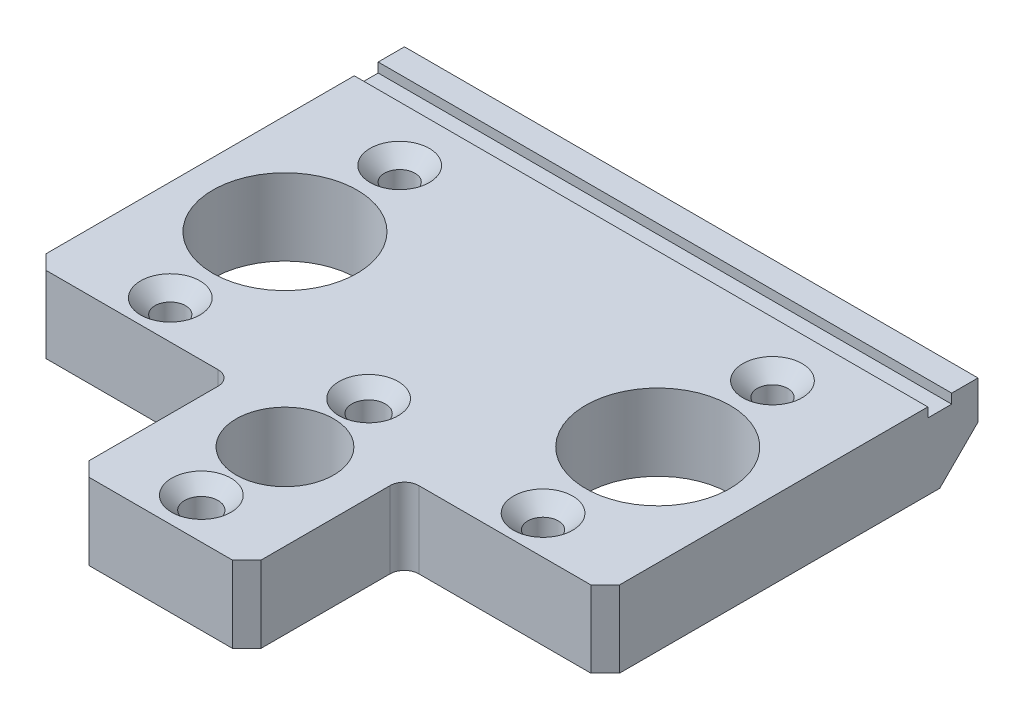
ISO-10303-21;
HEADER;
FILE_DESCRIPTION(('STEP AP214'),'2;1');
FILE_NAME('part.step','',(''),(''),'','','');
FILE_SCHEMA(('AUTOMOTIVE_DESIGN { 1 0 10303 214 1 1 1 1 }'));
ENDSEC;
DATA;
#1=APPLICATION_CONTEXT('core data for automotive mechanical design processes');
#2=APPLICATION_PROTOCOL_DEFINITION('international standard','automotive_design',2000,#1);
#3=PRODUCT_CONTEXT('',#1,'mechanical');
#4=PRODUCT('Part','Part','',(#3));
#5=PRODUCT_RELATED_PRODUCT_CATEGORY('part','',(#4));
#6=PRODUCT_DEFINITION_FORMATION('','',#4);
#7=PRODUCT_DEFINITION_CONTEXT('part definition',#1,'design');
#8=PRODUCT_DEFINITION('design','',#6,#7);
#9=PRODUCT_DEFINITION_SHAPE('','',#8);
#10=(LENGTH_UNIT() NAMED_UNIT(*) SI_UNIT(.MILLI.,.METRE.));
#11=(NAMED_UNIT(*) PLANE_ANGLE_UNIT() SI_UNIT($,.RADIAN.));
#12=(NAMED_UNIT(*) SI_UNIT($,.STERADIAN.) SOLID_ANGLE_UNIT());
#13=UNCERTAINTY_MEASURE_WITH_UNIT(LENGTH_MEASURE(1.E-05),#10,'distance_accuracy_value','');
#14=(GEOMETRIC_REPRESENTATION_CONTEXT(3) GLOBAL_UNCERTAINTY_ASSIGNED_CONTEXT((#13)) GLOBAL_UNIT_ASSIGNED_CONTEXT((#10,
#11,#12)) REPRESENTATION_CONTEXT('',''));
#15=CARTESIAN_POINT('',(0.,0.,0.));
#16=DIRECTION('',(0.,0.,1.));
#17=DIRECTION('',(1.,0.,0.));
#18=AXIS2_PLACEMENT_3D('',#15,#16,#17);
#19=CARTESIAN_POINT('',(0.,8.,0.));
#20=DIRECTION('',(0.,1.,0.));
#21=DIRECTION('',(0.,0.,1.));
#22=AXIS2_PLACEMENT_3D('',#19,#20,#21);
#23=PLANE('',#22);
#24=DIRECTION('',(1.,0.,0.));
#25=VECTOR('',#24,1.);
#26=CARTESIAN_POINT('',(-30.,8.,-17.25));
#27=LINE('',#26,#25);
#28=CARTESIAN_POINT('',(-30.,8.,-17.25));
#29=VERTEX_POINT('',#28);
#30=CARTESIAN_POINT('',(30.,8.,-17.25));
#31=VERTEX_POINT('',#30);
#32=EDGE_CURVE('E533',#29,#31,#27,.T.);
#33=ORIENTED_EDGE('',*,*,#32,.T.);
#34=DIRECTION('',(0.,0.,-1.));
#35=VECTOR('',#34,1.);
#36=CARTESIAN_POINT('',(30.,8.,-20.));
#37=LINE('',#36,#35);
#38=CARTESIAN_POINT('',(30.,8.,-20.));
#39=VERTEX_POINT('',#38);
#40=EDGE_CURVE('E199',#31,#39,#37,.T.);
#41=ORIENTED_EDGE('',*,*,#40,.T.);
#42=DIRECTION('',(-1.,0.,0.));
#43=VECTOR('',#42,1.);
#44=CARTESIAN_POINT('',(-30.,8.,-20.));
#45=LINE('',#44,#43);
#46=CARTESIAN_POINT('',(-30.,8.,-20.));
#47=VERTEX_POINT('',#46);
#48=EDGE_CURVE('E207',#39,#47,#45,.T.);
#49=ORIENTED_EDGE('',*,*,#48,.T.);
#50=DIRECTION('',(0.,0.,1.));
#51=VECTOR('',#50,1.);
#52=CARTESIAN_POINT('',(-30.,8.,-20.));
#53=LINE('',#52,#51);
#54=EDGE_CURVE('E195',#47,#29,#53,.T.);
#55=ORIENTED_EDGE('',*,*,#54,.T.);
#56=EDGE_LOOP('',(#33,#41,#49,#55));
#57=FACE_BOUND('',#56,.T.);
#58=ADVANCED_FACE('F37',(#57),#23,.T.);
#59=DIRECTION('',(1.,0.,0.));
#60=VECTOR('',#59,1.);
#61=CARTESIAN_POINT('',(-30.,8.,-14.75));
#62=LINE('',#61,#60);
#63=CARTESIAN_POINT('',(-30.,8.,-14.75));
#64=VERTEX_POINT('',#63);
#65=CARTESIAN_POINT('',(30.,8.,-14.75));
#66=VERTEX_POINT('',#65);
#67=EDGE_CURVE('E170',#64,#66,#62,.T.);
#68=ORIENTED_EDGE('',*,*,#67,.F.);
#69=CARTESIAN_POINT('',(-30.,8.,17.5));
#70=VERTEX_POINT('',#69);
#71=EDGE_CURVE('E184',#64,#70,#53,.T.);
#72=ORIENTED_EDGE('',*,*,#71,.T.);
#73=DIRECTION('',(0.707106781186548,0.,0.707106781186547));
#74=VECTOR('',#73,1.);
#75=CARTESIAN_POINT('',(-23.75,8.,23.75));
#76=LINE('',#75,#74);
#77=CARTESIAN_POINT('',(-28.5,8.,19.));
#78=VERTEX_POINT('',#77);
#79=EDGE_CURVE('E234',#70,#78,#76,.T.);
#80=ORIENTED_EDGE('',*,*,#79,.T.);
#81=DIRECTION('',(-1.,0.,0.));
#82=VECTOR('',#81,1.);
#83=CARTESIAN_POINT('',(-8.99999999999999,8.,19.));
#84=LINE('',#83,#82);
#85=CARTESIAN_POINT('',(-10.5,8.,19.));
#86=VERTEX_POINT('',#85);
#87=EDGE_CURVE('E303',#86,#78,#84,.T.);
#88=ORIENTED_EDGE('',*,*,#87,.F.);
#89=CARTESIAN_POINT('',(-10.5,8.,20.5));
#90=DIRECTION('',(0.,1.,0.));
#91=DIRECTION('',(0.,0.,1.));
#92=AXIS2_PLACEMENT_3D('',#89,#90,#91);
#93=CIRCLE('',#92,1.5);
#94=CARTESIAN_POINT('',(-8.99999999999999,7.99999999999999,20.5));
#95=VERTEX_POINT('',#94);
#96=EDGE_CURVE('E45',#86,#95,#93,.F.);
#97=ORIENTED_EDGE('',*,*,#96,.T.);
#98=DIRECTION('',(0.,0.,-1.));
#99=VECTOR('',#98,1.);
#100=CARTESIAN_POINT('',(-8.99999999999999,7.99999999999999,40.));
#101=LINE('',#100,#99);
#102=CARTESIAN_POINT('',(-8.99999999999999,7.99999999999999,34.));
#103=VERTEX_POINT('',#102);
#104=EDGE_CURVE('E318',#103,#95,#101,.T.);
#105=ORIENTED_EDGE('',*,*,#104,.F.);
#106=DIRECTION('',(0.707106781186546,0.,0.707106781186549));
#107=VECTOR('',#106,1.);
#108=CARTESIAN_POINT('',(-21.5,8.,21.4999999999999));
#109=LINE('',#108,#107);
#110=CARTESIAN_POINT('',(-7.5,7.99999999999999,35.5));
#111=VERTEX_POINT('',#110);
#112=EDGE_CURVE('E232',#103,#111,#109,.T.);
#113=ORIENTED_EDGE('',*,*,#112,.T.);
#114=DIRECTION('',(-1.,0.,0.));
#115=VECTOR('',#114,1.);
#116=CARTESIAN_POINT('',(8.99999999999999,7.99999999999999,35.5));
#117=LINE('',#116,#115);
#118=CARTESIAN_POINT('',(7.5,7.99999999999999,35.5));
#119=VERTEX_POINT('',#118);
#120=EDGE_CURVE('E498',#119,#111,#117,.T.);
#121=ORIENTED_EDGE('',*,*,#120,.F.);
#122=DIRECTION('',(0.707106781186546,0.,-0.707106781186549));
#123=VECTOR('',#122,1.);
#124=CARTESIAN_POINT('',(21.5,8.,21.4999999999999));
#125=LINE('',#124,#123);
#126=CARTESIAN_POINT('',(8.99999999999999,7.99999999999999,34.));
#127=VERTEX_POINT('',#126);
#128=EDGE_CURVE('E230',#119,#127,#125,.T.);
#129=ORIENTED_EDGE('',*,*,#128,.T.);
#130=DIRECTION('',(0.,0.,-1.));
#131=VECTOR('',#130,1.);
#132=CARTESIAN_POINT('',(8.99999999999999,7.99999999999999,40.));
#133=LINE('',#132,#131);
#134=CARTESIAN_POINT('',(8.99999999999999,7.99999999999999,20.5));
#135=VERTEX_POINT('',#134);
#136=EDGE_CURVE('E294',#127,#135,#133,.T.);
#137=ORIENTED_EDGE('',*,*,#136,.T.);
#138=CARTESIAN_POINT('',(10.5,8.,20.5));
#139=DIRECTION('',(0.,1.,0.));
#140=DIRECTION('',(0.,0.,1.));
#141=AXIS2_PLACEMENT_3D('',#138,#139,#140);
#142=CIRCLE('',#141,1.5);
#143=CARTESIAN_POINT('',(10.5,8.,19.));
#144=VERTEX_POINT('',#143);
#145=EDGE_CURVE('E287',#135,#144,#142,.F.);
#146=ORIENTED_EDGE('',*,*,#145,.T.);
#147=DIRECTION('',(-1.,0.,0.));
#148=VECTOR('',#147,1.);
#149=CARTESIAN_POINT('',(30.,8.,19.));
#150=LINE('',#149,#148);
#151=CARTESIAN_POINT('',(28.5,8.,19.));
#152=VERTEX_POINT('',#151);
#153=EDGE_CURVE('E292',#152,#144,#150,.T.);
#154=ORIENTED_EDGE('',*,*,#153,.F.);
#155=DIRECTION('',(0.707106781186545,0.,-0.70710678118655));
#156=VECTOR('',#155,1.);
#157=CARTESIAN_POINT('',(23.7500000000001,8.,23.7499999999999));
#158=LINE('',#157,#156);
#159=CARTESIAN_POINT('',(30.,8.,17.5));
#160=VERTEX_POINT('',#159);
#161=EDGE_CURVE('E236',#152,#160,#158,.T.);
#162=ORIENTED_EDGE('',*,*,#161,.T.);
#163=EDGE_CURVE('E187',#160,#66,#37,.T.);
#164=ORIENTED_EDGE('',*,*,#163,.T.);
#165=EDGE_LOOP('',(#68,#72,#80,#88,#97,#105,#113,#121,#129,#137,#146,#154,#162,#164));
#166=FACE_BOUND('',#165,.T.);
#167=CARTESIAN_POINT('',(0.,8.,31.25));
#168=DIRECTION('',(0.,1.,0.));
#169=DIRECTION('',(0.,0.,1.));
#170=AXIS2_PLACEMENT_3D('',#167,#168,#169);
#171=CIRCLE('',#170,3.1);
#172=CARTESIAN_POINT('',(0.,8.,34.35));
#173=VERTEX_POINT('',#172);
#174=EDGE_CURVE('E268',#173,#173,#171,.T.);
#175=ORIENTED_EDGE('',*,*,#174,.F.);
#176=EDGE_LOOP('',(#175));
#177=FACE_BOUND('',#176,.T.);
#178=CARTESIAN_POINT('',(0.,8.,13.75));
#179=DIRECTION('',(0.,1.,0.));
#180=DIRECTION('',(0.,0.,1.));
#181=AXIS2_PLACEMENT_3D('',#178,#179,#180);
#182=CIRCLE('',#181,3.1);
#183=CARTESIAN_POINT('',(0.,8.,16.85));
#184=VERTEX_POINT('',#183);
#185=EDGE_CURVE('E267',#184,#184,#182,.T.);
#186=ORIENTED_EDGE('',*,*,#185,.F.);
#187=EDGE_LOOP('',(#186));
#188=FACE_BOUND('',#187,.T.);
#189=CARTESIAN_POINT('',(19.5,8.,-9.));
#190=DIRECTION('',(0.,1.,0.));
#191=DIRECTION('',(0.,0.,1.));
#192=AXIS2_PLACEMENT_3D('',#189,#190,#191);
#193=CIRCLE('',#192,3.1);
#194=CARTESIAN_POINT('',(19.5,8.,-5.9));
#195=VERTEX_POINT('',#194);
#196=EDGE_CURVE('E544',#195,#195,#193,.T.);
#197=ORIENTED_EDGE('',*,*,#196,.F.);
#198=EDGE_LOOP('',(#197));
#199=FACE_BOUND('',#198,.T.);
#200=CARTESIAN_POINT('',(19.5,8.,15.));
#201=DIRECTION('',(0.,1.,0.));
#202=DIRECTION('',(0.,0.,1.));
#203=AXIS2_PLACEMENT_3D('',#200,#201,#202);
#204=CIRCLE('',#203,3.1);
#205=CARTESIAN_POINT('',(19.5,8.,18.1));
#206=VERTEX_POINT('',#205);
#207=EDGE_CURVE('E553',#206,#206,#204,.T.);
#208=ORIENTED_EDGE('',*,*,#207,.F.);
#209=EDGE_LOOP('',(#208));
#210=FACE_BOUND('',#209,.T.);
#211=CARTESIAN_POINT('',(-19.5,8.,15.));
#212=DIRECTION('',(0.,1.,0.));
#213=DIRECTION('',(0.,0.,1.));
#214=AXIS2_PLACEMENT_3D('',#211,#212,#213);
#215=CIRCLE('',#214,3.1);
#216=CARTESIAN_POINT('',(-19.5,8.,18.1));
#217=VERTEX_POINT('',#216);
#218=EDGE_CURVE('E562',#217,#217,#215,.T.);
#219=ORIENTED_EDGE('',*,*,#218,.F.);
#220=EDGE_LOOP('',(#219));
#221=FACE_BOUND('',#220,.T.);
#222=CARTESIAN_POINT('',(-19.5,8.,-9.));
#223=DIRECTION('',(0.,1.,0.));
#224=DIRECTION('',(0.,0.,1.));
#225=AXIS2_PLACEMENT_3D('',#222,#223,#224);
#226=CIRCLE('',#225,3.1);
#227=CARTESIAN_POINT('',(-19.5,8.,-5.9));
#228=VERTEX_POINT('',#227);
#229=EDGE_CURVE('E571',#228,#228,#226,.T.);
#230=ORIENTED_EDGE('',*,*,#229,.F.);
#231=EDGE_LOOP('',(#230));
#232=FACE_BOUND('',#231,.T.);
#233=CARTESIAN_POINT('',(0.,8.,22.5));
#234=DIRECTION('',(0.,1.,0.));
#235=DIRECTION('',(0.,0.,1.));
#236=AXIS2_PLACEMENT_3D('',#233,#234,#235);
#237=CIRCLE('',#236,5.1);
#238=CARTESIAN_POINT('',(0.,8.,27.6));
#239=VERTEX_POINT('',#238);
#240=EDGE_CURVE('E505',#239,#239,#237,.T.);
#241=ORIENTED_EDGE('',*,*,#240,.F.);
#242=EDGE_LOOP('',(#241));
#243=FACE_BOUND('',#242,.T.);
#244=CARTESIAN_POINT('',(-19.5,8.,3.));
#245=DIRECTION('',(0.,1.,0.));
#246=DIRECTION('',(0.,0.,1.));
#247=AXIS2_PLACEMENT_3D('',#244,#245,#246);
#248=CIRCLE('',#247,7.55);
#249=CARTESIAN_POINT('',(-19.5,8.,10.55));
#250=VERTEX_POINT('',#249);
#251=EDGE_CURVE('E210',#250,#250,#248,.T.);
#252=ORIENTED_EDGE('',*,*,#251,.F.);
#253=EDGE_LOOP('',(#252));
#254=FACE_BOUND('',#253,.T.);
#255=CARTESIAN_POINT('',(19.5,8.,3.));
#256=DIRECTION('',(0.,1.,0.));
#257=DIRECTION('',(0.,0.,-1.));
#258=AXIS2_PLACEMENT_3D('',#255,#256,#257);
#259=CIRCLE('',#258,7.55);
#260=CARTESIAN_POINT('',(19.5,8.,-4.55));
#261=VERTEX_POINT('',#260);
#262=EDGE_CURVE('E326',#261,#261,#259,.T.);
#263=ORIENTED_EDGE('',*,*,#262,.F.);
#264=EDGE_LOOP('',(#263));
#265=FACE_BOUND('',#264,.T.);
#266=ADVANCED_FACE('F181',(#166,#177,#188,#199,#210,#221,#232,#243,#254,#265),#23,.T.);
#267=CARTESIAN_POINT('',(0.,0.,0.));
#268=DIRECTION('',(0.,1.,0.));
#269=DIRECTION('',(0.,0.,1.));
#270=AXIS2_PLACEMENT_3D('',#267,#268,#269);
#271=PLANE('',#270);
#272=CARTESIAN_POINT('',(19.5,0.,-9.));
#273=DIRECTION('',(0.,1.,0.));
#274=DIRECTION('',(0.,0.,1.));
#275=AXIS2_PLACEMENT_3D('',#272,#273,#274);
#276=CIRCLE('',#275,1.6);
#277=CARTESIAN_POINT('',(19.5,0.,-7.4));
#278=VERTEX_POINT('',#277);
#279=EDGE_CURVE('E550',#278,#278,#276,.T.);
#280=ORIENTED_EDGE('',*,*,#279,.T.);
#281=EDGE_LOOP('',(#280));
#282=FACE_BOUND('',#281,.T.);
#283=CARTESIAN_POINT('',(19.5,0.,15.));
#284=DIRECTION('',(0.,1.,0.));
#285=DIRECTION('',(0.,0.,1.));
#286=AXIS2_PLACEMENT_3D('',#283,#284,#285);
#287=CIRCLE('',#286,1.6);
#288=CARTESIAN_POINT('',(19.5,0.,16.6));
#289=VERTEX_POINT('',#288);
#290=EDGE_CURVE('E559',#289,#289,#287,.T.);
#291=ORIENTED_EDGE('',*,*,#290,.T.);
#292=EDGE_LOOP('',(#291));
#293=FACE_BOUND('',#292,.T.);
#294=CARTESIAN_POINT('',(-19.5,0.,15.));
#295=DIRECTION('',(0.,1.,0.));
#296=DIRECTION('',(0.,0.,1.));
#297=AXIS2_PLACEMENT_3D('',#294,#295,#296);
#298=CIRCLE('',#297,1.6);
#299=CARTESIAN_POINT('',(-19.5,0.,16.6));
#300=VERTEX_POINT('',#299);
#301=EDGE_CURVE('E568',#300,#300,#298,.T.);
#302=ORIENTED_EDGE('',*,*,#301,.T.);
#303=EDGE_LOOP('',(#302));
#304=FACE_BOUND('',#303,.T.);
#305=CARTESIAN_POINT('',(-19.5,0.,-9.));
#306=DIRECTION('',(0.,1.,0.));
#307=DIRECTION('',(0.,0.,1.));
#308=AXIS2_PLACEMENT_3D('',#305,#306,#307);
#309=CIRCLE('',#308,1.6);
#310=CARTESIAN_POINT('',(-19.5,0.,-7.4));
#311=VERTEX_POINT('',#310);
#312=EDGE_CURVE('E577',#311,#311,#309,.T.);
#313=ORIENTED_EDGE('',*,*,#312,.T.);
#314=EDGE_LOOP('',(#313));
#315=FACE_BOUND('',#314,.T.);
#316=CARTESIAN_POINT('',(19.5,0.,3.));
#317=DIRECTION('',(0.,1.,0.));
#318=DIRECTION('',(0.,0.,-1.));
#319=AXIS2_PLACEMENT_3D('',#316,#317,#318);
#320=CIRCLE('',#319,7.55);
#321=CARTESIAN_POINT('',(19.5,0.,-4.55));
#322=VERTEX_POINT('',#321);
#323=EDGE_CURVE('E325',#322,#322,#320,.T.);
#324=ORIENTED_EDGE('',*,*,#323,.T.);
#325=EDGE_LOOP('',(#324));
#326=FACE_BOUND('',#325,.T.);
#327=CARTESIAN_POINT('',(-19.5,0.,3.));
#328=DIRECTION('',(0.,1.,0.));
#329=DIRECTION('',(0.,0.,1.));
#330=AXIS2_PLACEMENT_3D('',#327,#328,#329);
#331=CIRCLE('',#330,7.55);
#332=CARTESIAN_POINT('',(-19.5,0.,10.55));
#333=VERTEX_POINT('',#332);
#334=EDGE_CURVE('E204',#333,#333,#331,.T.);
#335=ORIENTED_EDGE('',*,*,#334,.T.);
#336=EDGE_LOOP('',(#335));
#337=FACE_BOUND('',#336,.T.);
#338=CARTESIAN_POINT('',(0.,0.,22.5));
#339=DIRECTION('',(0.,1.,0.));
#340=DIRECTION('',(0.,0.,1.));
#341=AXIS2_PLACEMENT_3D('',#338,#339,#340);
#342=CIRCLE('',#341,5.1);
#343=CARTESIAN_POINT('',(0.,0.,27.6));
#344=VERTEX_POINT('',#343);
#345=EDGE_CURVE('E320',#344,#344,#342,.T.);
#346=ORIENTED_EDGE('',*,*,#345,.T.);
#347=EDGE_LOOP('',(#346));
#348=FACE_BOUND('',#347,.T.);
#349=CARTESIAN_POINT('',(0.,0.,13.75));
#350=DIRECTION('',(0.,1.,0.));
#351=DIRECTION('',(0.,0.,1.));
#352=AXIS2_PLACEMENT_3D('',#349,#350,#351);
#353=CIRCLE('',#352,1.75);
#354=CARTESIAN_POINT('',(0.,0.,15.5));
#355=VERTEX_POINT('',#354);
#356=EDGE_CURVE('E502',#355,#355,#353,.T.);
#357=ORIENTED_EDGE('',*,*,#356,.T.);
#358=EDGE_LOOP('',(#357));
#359=FACE_BOUND('',#358,.T.);
#360=CARTESIAN_POINT('',(0.,0.,31.25));
#361=DIRECTION('',(0.,1.,0.));
#362=DIRECTION('',(0.,0.,1.));
#363=AXIS2_PLACEMENT_3D('',#360,#361,#362);
#364=CIRCLE('',#363,1.75);
#365=CARTESIAN_POINT('',(0.,0.,33.));
#366=VERTEX_POINT('',#365);
#367=EDGE_CURVE('E506',#366,#366,#364,.T.);
#368=ORIENTED_EDGE('',*,*,#367,.T.);
#369=EDGE_LOOP('',(#368));
#370=FACE_BOUND('',#369,.T.);
#371=DIRECTION('',(0.,0.,-1.));
#372=VECTOR('',#371,1.);
#373=CARTESIAN_POINT('',(30.,0.,-20.));
#374=LINE('',#373,#372);
#375=CARTESIAN_POINT('',(30.,0.,17.5));
#376=VERTEX_POINT('',#375);
#377=CARTESIAN_POINT('',(30.,0.,-16.));
#378=VERTEX_POINT('',#377);
#379=EDGE_CURVE('E196',#376,#378,#374,.T.);
#380=ORIENTED_EDGE('',*,*,#379,.F.);
#381=DIRECTION('',(-0.707106781186545,0.,0.70710678118655));
#382=VECTOR('',#381,1.);
#383=CARTESIAN_POINT('',(28.5,0.,19.));
#384=LINE('',#383,#382);
#385=CARTESIAN_POINT('',(28.5,0.,19.));
#386=VERTEX_POINT('',#385);
#387=EDGE_CURVE('E246',#376,#386,#384,.T.);
#388=ORIENTED_EDGE('',*,*,#387,.T.);
#389=DIRECTION('',(1.,0.,0.));
#390=VECTOR('',#389,1.);
#391=CARTESIAN_POINT('',(8.99999999999999,0.,19.));
#392=LINE('',#391,#390);
#393=CARTESIAN_POINT('',(10.5,0.,19.));
#394=VERTEX_POINT('',#393);
#395=EDGE_CURVE('E302',#394,#386,#392,.T.);
#396=ORIENTED_EDGE('',*,*,#395,.F.);
#397=CARTESIAN_POINT('',(10.5,0.,20.5));
#398=DIRECTION('',(0.,1.,0.));
#399=DIRECTION('',(0.,0.,1.));
#400=AXIS2_PLACEMENT_3D('',#397,#398,#399);
#401=CIRCLE('',#400,1.5);
#402=CARTESIAN_POINT('',(8.99999999999999,0.,20.5));
#403=VERTEX_POINT('',#402);
#404=EDGE_CURVE('E285',#394,#403,#401,.T.);
#405=ORIENTED_EDGE('',*,*,#404,.T.);
#406=DIRECTION('',(0.,0.,-1.));
#407=VECTOR('',#406,1.);
#408=CARTESIAN_POINT('',(8.99999999999999,0.,40.));
#409=LINE('',#408,#407);
#410=CARTESIAN_POINT('',(8.99999999999999,0.,34.));
#411=VERTEX_POINT('',#410);
#412=EDGE_CURVE('E311',#411,#403,#409,.T.);
#413=ORIENTED_EDGE('',*,*,#412,.F.);
#414=DIRECTION('',(-0.707106781186546,0.,0.707106781186549));
#415=VECTOR('',#414,1.);
#416=CARTESIAN_POINT('',(7.5,0.,35.5));
#417=LINE('',#416,#415);
#418=CARTESIAN_POINT('',(7.5,0.,35.5));
#419=VERTEX_POINT('',#418);
#420=EDGE_CURVE('E240',#411,#419,#417,.T.);
#421=ORIENTED_EDGE('',*,*,#420,.T.);
#422=DIRECTION('',(1.,0.,0.));
#423=VECTOR('',#422,1.);
#424=CARTESIAN_POINT('',(-8.99999999999999,0.,35.5));
#425=LINE('',#424,#423);
#426=CARTESIAN_POINT('',(-7.5,0.,35.5));
#427=VERTEX_POINT('',#426);
#428=EDGE_CURVE('E494',#427,#419,#425,.T.);
#429=ORIENTED_EDGE('',*,*,#428,.F.);
#430=DIRECTION('',(-0.707106781186546,0.,-0.707106781186549));
#431=VECTOR('',#430,1.);
#432=CARTESIAN_POINT('',(-7.5,0.,35.5));
#433=LINE('',#432,#431);
#434=CARTESIAN_POINT('',(-8.99999999999999,0.,34.));
#435=VERTEX_POINT('',#434);
#436=EDGE_CURVE('E242',#427,#435,#433,.T.);
#437=ORIENTED_EDGE('',*,*,#436,.T.);
#438=DIRECTION('',(0.,0.,-1.));
#439=VECTOR('',#438,1.);
#440=CARTESIAN_POINT('',(-8.99999999999999,0.,40.));
#441=LINE('',#440,#439);
#442=CARTESIAN_POINT('',(-8.99999999999999,0.,20.5));
#443=VERTEX_POINT('',#442);
#444=EDGE_CURVE('E316',#435,#443,#441,.T.);
#445=ORIENTED_EDGE('',*,*,#444,.T.);
#446=CARTESIAN_POINT('',(-10.5,0.,20.5));
#447=DIRECTION('',(0.,1.,0.));
#448=DIRECTION('',(0.,0.,1.));
#449=AXIS2_PLACEMENT_3D('',#446,#447,#448);
#450=CIRCLE('',#449,1.5);
#451=CARTESIAN_POINT('',(-10.5,0.,19.));
#452=VERTEX_POINT('',#451);
#453=EDGE_CURVE('E11',#443,#452,#450,.T.);
#454=ORIENTED_EDGE('',*,*,#453,.T.);
#455=DIRECTION('',(1.,0.,0.));
#456=VECTOR('',#455,1.);
#457=CARTESIAN_POINT('',(-30.,0.,19.));
#458=LINE('',#457,#456);
#459=CARTESIAN_POINT('',(-28.5,0.,19.));
#460=VERTEX_POINT('',#459);
#461=EDGE_CURVE('E492',#460,#452,#458,.T.);
#462=ORIENTED_EDGE('',*,*,#461,.F.);
#463=DIRECTION('',(-0.707106781186548,0.,-0.707106781186547));
#464=VECTOR('',#463,1.);
#465=CARTESIAN_POINT('',(-28.5,0.,19.));
#466=LINE('',#465,#464);
#467=CARTESIAN_POINT('',(-30.,0.,17.5));
#468=VERTEX_POINT('',#467);
#469=EDGE_CURVE('E244',#460,#468,#466,.T.);
#470=ORIENTED_EDGE('',*,*,#469,.T.);
#471=DIRECTION('',(0.,0.,1.));
#472=VECTOR('',#471,1.);
#473=CARTESIAN_POINT('',(-30.,0.,-20.));
#474=LINE('',#473,#472);
#475=CARTESIAN_POINT('',(-30.,0.,-16.));
#476=VERTEX_POINT('',#475);
#477=EDGE_CURVE('E200',#476,#468,#474,.T.);
#478=ORIENTED_EDGE('',*,*,#477,.F.);
#479=DIRECTION('',(1.,0.,0.));
#480=VECTOR('',#479,1.);
#481=CARTESIAN_POINT('',(0.,0.,-16.));
#482=LINE('',#481,#480);
#483=EDGE_CURVE('E222',#476,#378,#482,.T.);
#484=ORIENTED_EDGE('',*,*,#483,.T.);
#485=EDGE_LOOP('',(#380,#388,#396,#405,#413,#421,#429,#437,#445,#454,#462,#470,#478,#484));
#486=FACE_BOUND('',#485,.T.);
#487=ADVANCED_FACE('F310',(#282,#293,#304,#315,#326,#337,#348,#359,#370,#486),#271,.F.);
#488=CARTESIAN_POINT('',(-8.99999999999999,7.99999999999999,40.));
#489=DIRECTION('',(1.,0.,0.));
#490=DIRECTION('',(0.,0.,-1.));
#491=AXIS2_PLACEMENT_3D('',#488,#489,#490);
#492=PLANE('',#491);
#493=ORIENTED_EDGE('',*,*,#104,.T.);
#494=DIRECTION('',(0.,1.,0.));
#495=VECTOR('',#494,1.);
#496=CARTESIAN_POINT('',(-8.99999999999999,7.99999999999999,20.5));
#497=LINE('',#496,#495);
#498=EDGE_CURVE('E58',#95,#443,#497,.F.);
#499=ORIENTED_EDGE('',*,*,#498,.T.);
#500=ORIENTED_EDGE('',*,*,#444,.F.);
#501=DIRECTION('',(0.,1.,0.));
#502=VECTOR('',#501,1.);
#503=CARTESIAN_POINT('',(-8.99999999999999,7.99999999999999,34.));
#504=LINE('',#503,#502);
#505=EDGE_CURVE('E259',#435,#103,#504,.T.);
#506=ORIENTED_EDGE('',*,*,#505,.T.);
#507=EDGE_LOOP('',(#493,#499,#500,#506));
#508=FACE_BOUND('',#507,.T.);
#509=ADVANCED_FACE('F362',(#508),#492,.F.);
#510=CARTESIAN_POINT('',(8.99999999999999,7.99999999999999,40.));
#511=DIRECTION('',(-1.,0.,0.));
#512=DIRECTION('',(0.,0.,1.));
#513=AXIS2_PLACEMENT_3D('',#510,#511,#512);
#514=PLANE('',#513);
#515=ORIENTED_EDGE('',*,*,#412,.T.);
#516=DIRECTION('',(0.,-1.,0.));
#517=VECTOR('',#516,1.);
#518=CARTESIAN_POINT('',(8.99999999999999,7.99999999999999,20.5));
#519=LINE('',#518,#517);
#520=EDGE_CURVE('E279',#403,#135,#519,.F.);
#521=ORIENTED_EDGE('',*,*,#520,.T.);
#522=ORIENTED_EDGE('',*,*,#136,.F.);
#523=DIRECTION('',(0.,-1.,0.));
#524=VECTOR('',#523,1.);
#525=CARTESIAN_POINT('',(8.99999999999999,0.,34.));
#526=LINE('',#525,#524);
#527=EDGE_CURVE('E261',#127,#411,#526,.T.);
#528=ORIENTED_EDGE('',*,*,#527,.T.);
#529=EDGE_LOOP('',(#515,#521,#522,#528));
#530=FACE_BOUND('',#529,.T.);
#531=ADVANCED_FACE('F314',(#530),#514,.F.);
#532=CARTESIAN_POINT('',(-30.,8.,-20.));
#533=DIRECTION('',(1.,0.,0.));
#534=DIRECTION('',(0.,0.,-1.));
#535=AXIS2_PLACEMENT_3D('',#532,#533,#534);
#536=PLANE('',#535);
#537=DIRECTION('',(0.,0.,-1.));
#538=VECTOR('',#537,1.);
#539=CARTESIAN_POINT('',(-30.,7.,-14.75));
#540=LINE('',#539,#538);
#541=CARTESIAN_POINT('',(-30.,7.,-14.75));
#542=VERTEX_POINT('',#541);
#543=CARTESIAN_POINT('',(-30.,7.,-17.25));
#544=VERTEX_POINT('',#543);
#545=EDGE_CURVE('E178',#542,#544,#540,.T.);
#546=ORIENTED_EDGE('',*,*,#545,.T.);
#547=DIRECTION('',(0.,1.,0.));
#548=VECTOR('',#547,1.);
#549=CARTESIAN_POINT('',(-30.,7.,-17.25));
#550=LINE('',#549,#548);
#551=EDGE_CURVE('E188',#544,#29,#550,.T.);
#552=ORIENTED_EDGE('',*,*,#551,.T.);
#553=ORIENTED_EDGE('',*,*,#54,.F.);
#554=DIRECTION('',(0.,-1.,0.));
#555=VECTOR('',#554,1.);
#556=CARTESIAN_POINT('',(-30.,8.,-20.));
#557=LINE('',#556,#555);
#558=CARTESIAN_POINT('',(-30.,4.00000000000001,-20.));
#559=VERTEX_POINT('',#558);
#560=EDGE_CURVE('E209',#47,#559,#557,.T.);
#561=ORIENTED_EDGE('',*,*,#560,.T.);
#562=DIRECTION('',(0.,0.707106781186546,-0.707106781186549));
#563=VECTOR('',#562,1.);
#564=CARTESIAN_POINT('',(-30.,4.00000000000001,-20.));
#565=LINE('',#564,#563);
#566=EDGE_CURVE('E220',#559,#476,#565,.F.);
#567=ORIENTED_EDGE('',*,*,#566,.T.);
#568=ORIENTED_EDGE('',*,*,#477,.T.);
#569=DIRECTION('',(0.,1.,0.));
#570=VECTOR('',#569,1.);
#571=CARTESIAN_POINT('',(-30.,8.,17.5));
#572=LINE('',#571,#570);
#573=EDGE_CURVE('E193',#468,#70,#572,.T.);
#574=ORIENTED_EDGE('',*,*,#573,.T.);
#575=ORIENTED_EDGE('',*,*,#71,.F.);
#576=DIRECTION('',(0.,-1.,0.));
#577=VECTOR('',#576,1.);
#578=CARTESIAN_POINT('',(-30.,8.,-14.75));
#579=LINE('',#578,#577);
#580=EDGE_CURVE('E167',#64,#542,#579,.T.);
#581=ORIENTED_EDGE('',*,*,#580,.T.);
#582=EDGE_LOOP('',(#546,#552,#553,#561,#567,#568,#574,#575,#581));
#583=FACE_BOUND('',#582,.T.);
#584=ADVANCED_FACE('F190',(#583),#536,.F.);
#585=CARTESIAN_POINT('',(30.,8.,-20.));
#586=DIRECTION('',(-1.,0.,0.));
#587=DIRECTION('',(0.,0.,1.));
#588=AXIS2_PLACEMENT_3D('',#585,#586,#587);
#589=PLANE('',#588);
#590=ORIENTED_EDGE('',*,*,#40,.F.);
#591=DIRECTION('',(0.,-1.,0.));
#592=VECTOR('',#591,1.);
#593=CARTESIAN_POINT('',(30.,7.99999999999999,-17.25));
#594=LINE('',#593,#592);
#595=CARTESIAN_POINT('',(30.,7.,-17.25));
#596=VERTEX_POINT('',#595);
#597=EDGE_CURVE('E273',#31,#596,#594,.T.);
#598=ORIENTED_EDGE('',*,*,#597,.T.);
#599=DIRECTION('',(0.,0.,1.));
#600=VECTOR('',#599,1.);
#601=CARTESIAN_POINT('',(30.,7.,-20.));
#602=LINE('',#601,#600);
#603=CARTESIAN_POINT('',(30.,7.,-14.75));
#604=VERTEX_POINT('',#603);
#605=EDGE_CURVE('E270',#596,#604,#602,.T.);
#606=ORIENTED_EDGE('',*,*,#605,.T.);
#607=DIRECTION('',(0.,1.,0.));
#608=VECTOR('',#607,1.);
#609=CARTESIAN_POINT('',(30.,8.,-14.75));
#610=LINE('',#609,#608);
#611=EDGE_CURVE('E263',#604,#66,#610,.T.);
#612=ORIENTED_EDGE('',*,*,#611,.T.);
#613=ORIENTED_EDGE('',*,*,#163,.F.);
#614=DIRECTION('',(0.,-1.,0.));
#615=VECTOR('',#614,1.);
#616=CARTESIAN_POINT('',(30.,0.,17.5));
#617=LINE('',#616,#615);
#618=EDGE_CURVE('E238',#160,#376,#617,.T.);
#619=ORIENTED_EDGE('',*,*,#618,.T.);
#620=ORIENTED_EDGE('',*,*,#379,.T.);
#621=DIRECTION('',(0.,-0.707106781186546,0.707106781186549));
#622=VECTOR('',#621,1.);
#623=CARTESIAN_POINT('',(30.,4.00000000000001,-20.));
#624=LINE('',#623,#622);
#625=CARTESIAN_POINT('',(30.,4.00000000000001,-20.));
#626=VERTEX_POINT('',#625);
#627=EDGE_CURVE('E225',#378,#626,#624,.F.);
#628=ORIENTED_EDGE('',*,*,#627,.T.);
#629=DIRECTION('',(0.,-1.,0.));
#630=VECTOR('',#629,1.);
#631=CARTESIAN_POINT('',(30.,8.,-20.));
#632=LINE('',#631,#630);
#633=EDGE_CURVE('E214',#39,#626,#632,.T.);
#634=ORIENTED_EDGE('',*,*,#633,.F.);
#635=EDGE_LOOP('',(#590,#598,#606,#612,#613,#619,#620,#628,#634));
#636=FACE_BOUND('',#635,.T.);
#637=ADVANCED_FACE('F350',(#636),#589,.F.);
#638=CARTESIAN_POINT('',(-30.,8.,-20.));
#639=DIRECTION('',(0.,0.,1.));
#640=DIRECTION('',(1.,0.,0.));
#641=AXIS2_PLACEMENT_3D('',#638,#639,#640);
#642=PLANE('',#641);
#643=ORIENTED_EDGE('',*,*,#633,.T.);
#644=DIRECTION('',(-1.,0.,0.));
#645=VECTOR('',#644,1.);
#646=CARTESIAN_POINT('',(-30.,4.00000000000001,-20.));
#647=LINE('',#646,#645);
#648=EDGE_CURVE('E217',#626,#559,#647,.T.);
#649=ORIENTED_EDGE('',*,*,#648,.T.);
#650=ORIENTED_EDGE('',*,*,#560,.F.);
#651=ORIENTED_EDGE('',*,*,#48,.F.);
#652=EDGE_LOOP('',(#643,#649,#650,#651));
#653=FACE_BOUND('',#652,.T.);
#654=ADVANCED_FACE('F341',(#653),#642,.F.);
#655=CARTESIAN_POINT('',(-19.5,8.,3.));
#656=DIRECTION('',(0.,-1.,0.));
#657=DIRECTION('',(0.,0.,-1.));
#658=AXIS2_PLACEMENT_3D('',#655,#656,#657);
#659=CYLINDRICAL_SURFACE('',#658,7.55);
#660=ORIENTED_EDGE('',*,*,#251,.T.);
#661=EDGE_LOOP('',(#660));
#662=FACE_BOUND('',#661,.T.);
#663=ORIENTED_EDGE('',*,*,#334,.F.);
#664=EDGE_LOOP('',(#663));
#665=FACE_BOUND('',#664,.T.);
#666=ADVANCED_FACE('F338',(#662,#665),#659,.F.);
#667=CARTESIAN_POINT('',(19.5,8.,3.));
#668=DIRECTION('',(0.,-1.,0.));
#669=DIRECTION('',(0.,0.,-1.));
#670=AXIS2_PLACEMENT_3D('',#667,#668,#669);
#671=CYLINDRICAL_SURFACE('',#670,7.55);
#672=ORIENTED_EDGE('',*,*,#262,.T.);
#673=EDGE_LOOP('',(#672));
#674=FACE_BOUND('',#673,.T.);
#675=ORIENTED_EDGE('',*,*,#323,.F.);
#676=EDGE_LOOP('',(#675));
#677=FACE_BOUND('',#676,.T.);
#678=ADVANCED_FACE('F340',(#674,#677),#671,.F.);
#679=CARTESIAN_POINT('',(-30.,4.00000000000001,-20.));
#680=DIRECTION('',(0.,0.707106781186549,0.707106781186546));
#681=DIRECTION('',(-1.,0.,0.));
#682=AXIS2_PLACEMENT_3D('',#679,#680,#681);
#683=PLANE('',#682);
#684=ORIENTED_EDGE('',*,*,#627,.F.);
#685=ORIENTED_EDGE('',*,*,#483,.F.);
#686=ORIENTED_EDGE('',*,*,#566,.F.);
#687=ORIENTED_EDGE('',*,*,#648,.F.);
#688=EDGE_LOOP('',(#684,#685,#686,#687));
#689=FACE_BOUND('',#688,.T.);
#690=ADVANCED_FACE('F347',(#689),#683,.F.);
#691=CARTESIAN_POINT('',(0.,0.,22.5));
#692=DIRECTION('',(0.,1.,0.));
#693=DIRECTION('',(0.,0.,1.));
#694=AXIS2_PLACEMENT_3D('',#691,#692,#693);
#695=CYLINDRICAL_SURFACE('',#694,5.1);
#696=ORIENTED_EDGE('',*,*,#345,.F.);
#697=EDGE_LOOP('',(#696));
#698=FACE_BOUND('',#697,.T.);
#699=ORIENTED_EDGE('',*,*,#240,.T.);
#700=EDGE_LOOP('',(#699));
#701=FACE_BOUND('',#700,.T.);
#702=ADVANCED_FACE('F376',(#698,#701),#695,.F.);
#703=CARTESIAN_POINT('',(0.,0.,13.75));
#704=DIRECTION('',(0.,1.,0.));
#705=DIRECTION('',(0.,0.,1.));
#706=AXIS2_PLACEMENT_3D('',#703,#704,#705);
#707=CYLINDRICAL_SURFACE('',#706,1.75);
#708=CARTESIAN_POINT('',(0.,6.65,13.75));
#709=DIRECTION('',(0.,1.,0.));
#710=DIRECTION('',(0.,0.,1.));
#711=AXIS2_PLACEMENT_3D('',#708,#709,#710);
#712=CIRCLE('',#711,1.75);
#713=CARTESIAN_POINT('',(0.,6.65,15.5));
#714=VERTEX_POINT('',#713);
#715=EDGE_CURVE('E541',#714,#714,#712,.T.);
#716=ORIENTED_EDGE('',*,*,#715,.T.);
#717=EDGE_LOOP('',(#716));
#718=FACE_BOUND('',#717,.T.);
#719=ORIENTED_EDGE('',*,*,#356,.F.);
#720=EDGE_LOOP('',(#719));
#721=FACE_BOUND('',#720,.T.);
#722=ADVANCED_FACE('F471',(#718,#721),#707,.F.);
#723=CARTESIAN_POINT('',(0.,0.,31.25));
#724=DIRECTION('',(0.,1.,0.));
#725=DIRECTION('',(0.,0.,1.));
#726=AXIS2_PLACEMENT_3D('',#723,#724,#725);
#727=CYLINDRICAL_SURFACE('',#726,1.75);
#728=CARTESIAN_POINT('',(0.,6.65,31.25));
#729=DIRECTION('',(0.,1.,0.));
#730=DIRECTION('',(0.,0.,1.));
#731=AXIS2_PLACEMENT_3D('',#728,#729,#730);
#732=CIRCLE('',#731,1.75);
#733=CARTESIAN_POINT('',(0.,6.65,33.));
#734=VERTEX_POINT('',#733);
#735=EDGE_CURVE('E264',#734,#734,#732,.T.);
#736=ORIENTED_EDGE('',*,*,#735,.T.);
#737=EDGE_LOOP('',(#736));
#738=FACE_BOUND('',#737,.T.);
#739=ORIENTED_EDGE('',*,*,#367,.F.);
#740=EDGE_LOOP('',(#739));
#741=FACE_BOUND('',#740,.T.);
#742=ADVANCED_FACE('F467',(#738,#741),#727,.F.);
#743=CARTESIAN_POINT('',(0.,0.,19.));
#744=DIRECTION('',(0.,0.,1.));
#745=DIRECTION('',(1.,0.,0.));
#746=AXIS2_PLACEMENT_3D('',#743,#744,#745);
#747=PLANE('',#746);
#748=ORIENTED_EDGE('',*,*,#153,.T.);
#749=DIRECTION('',(0.,-1.,0.));
#750=VECTOR('',#749,1.);
#751=CARTESIAN_POINT('',(10.5,0.,19.));
#752=LINE('',#751,#750);
#753=EDGE_CURVE('E276',#144,#394,#752,.T.);
#754=ORIENTED_EDGE('',*,*,#753,.T.);
#755=ORIENTED_EDGE('',*,*,#395,.T.);
#756=DIRECTION('',(0.,1.,0.));
#757=VECTOR('',#756,1.);
#758=CARTESIAN_POINT('',(28.5,8.,19.));
#759=LINE('',#758,#757);
#760=EDGE_CURVE('E227',#386,#152,#759,.T.);
#761=ORIENTED_EDGE('',*,*,#760,.T.);
#762=EDGE_LOOP('',(#748,#754,#755,#761));
#763=FACE_BOUND('',#762,.T.);
#764=ADVANCED_FACE('F299',(#763),#747,.T.);
#765=CARTESIAN_POINT('',(0.,0.,19.));
#766=DIRECTION('',(0.,0.,1.));
#767=DIRECTION('',(1.,0.,0.));
#768=AXIS2_PLACEMENT_3D('',#765,#766,#767);
#769=PLANE('',#768);
#770=ORIENTED_EDGE('',*,*,#461,.T.);
#771=DIRECTION('',(0.,1.,0.));
#772=VECTOR('',#771,1.);
#773=CARTESIAN_POINT('',(-10.5,0.,19.));
#774=LINE('',#773,#772);
#775=EDGE_CURVE('E281',#452,#86,#774,.T.);
#776=ORIENTED_EDGE('',*,*,#775,.T.);
#777=ORIENTED_EDGE('',*,*,#87,.T.);
#778=DIRECTION('',(0.,-1.,0.));
#779=VECTOR('',#778,1.);
#780=CARTESIAN_POINT('',(-28.5,0.,19.));
#781=LINE('',#780,#779);
#782=EDGE_CURVE('E249',#78,#460,#781,.T.);
#783=ORIENTED_EDGE('',*,*,#782,.T.);
#784=EDGE_LOOP('',(#770,#776,#777,#783));
#785=FACE_BOUND('',#784,.T.);
#786=ADVANCED_FACE('F463',(#785),#769,.T.);
#787=CARTESIAN_POINT('',(0.,0.,35.5));
#788=DIRECTION('',(0.,0.,1.));
#789=DIRECTION('',(1.,0.,0.));
#790=AXIS2_PLACEMENT_3D('',#787,#788,#789);
#791=PLANE('',#790);
#792=ORIENTED_EDGE('',*,*,#120,.T.);
#793=DIRECTION('',(0.,-1.,0.));
#794=VECTOR('',#793,1.);
#795=CARTESIAN_POINT('',(-7.5,0.,35.5));
#796=LINE('',#795,#794);
#797=EDGE_CURVE('E256',#111,#427,#796,.T.);
#798=ORIENTED_EDGE('',*,*,#797,.T.);
#799=ORIENTED_EDGE('',*,*,#428,.T.);
#800=DIRECTION('',(0.,1.,0.));
#801=VECTOR('',#800,1.);
#802=CARTESIAN_POINT('',(7.5,7.99999999999999,35.5));
#803=LINE('',#802,#801);
#804=EDGE_CURVE('E253',#419,#119,#803,.T.);
#805=ORIENTED_EDGE('',*,*,#804,.T.);
#806=EDGE_LOOP('',(#792,#798,#799,#805));
#807=FACE_BOUND('',#806,.T.);
#808=ADVANCED_FACE('F385',(#807),#791,.T.);
#809=CARTESIAN_POINT('',(28.5,0.,19.));
#810=DIRECTION('',(0.70710678118655,0.,0.707106781186545));
#811=DIRECTION('',(0.,-1.,0.));
#812=AXIS2_PLACEMENT_3D('',#809,#810,#811);
#813=PLANE('',#812);
#814=ORIENTED_EDGE('',*,*,#387,.F.);
#815=ORIENTED_EDGE('',*,*,#618,.F.);
#816=ORIENTED_EDGE('',*,*,#161,.F.);
#817=ORIENTED_EDGE('',*,*,#760,.F.);
#818=EDGE_LOOP('',(#814,#815,#816,#817));
#819=FACE_BOUND('',#818,.T.);
#820=ADVANCED_FACE('F378',(#819),#813,.T.);
#821=CARTESIAN_POINT('',(-28.5,0.,19.));
#822=DIRECTION('',(-0.707106781186547,0.,0.707106781186548));
#823=DIRECTION('',(0.,1.,0.));
#824=AXIS2_PLACEMENT_3D('',#821,#822,#823);
#825=PLANE('',#824);
#826=ORIENTED_EDGE('',*,*,#79,.F.);
#827=ORIENTED_EDGE('',*,*,#573,.F.);
#828=ORIENTED_EDGE('',*,*,#469,.F.);
#829=ORIENTED_EDGE('',*,*,#782,.F.);
#830=EDGE_LOOP('',(#826,#827,#828,#829));
#831=FACE_BOUND('',#830,.T.);
#832=ADVANCED_FACE('F384',(#831),#825,.T.);
#833=CARTESIAN_POINT('',(-7.5,0.,35.5));
#834=DIRECTION('',(-0.707106781186549,0.,0.707106781186546));
#835=DIRECTION('',(0.,1.,0.));
#836=AXIS2_PLACEMENT_3D('',#833,#834,#835);
#837=PLANE('',#836);
#838=ORIENTED_EDGE('',*,*,#112,.F.);
#839=ORIENTED_EDGE('',*,*,#505,.F.);
#840=ORIENTED_EDGE('',*,*,#436,.F.);
#841=ORIENTED_EDGE('',*,*,#797,.F.);
#842=EDGE_LOOP('',(#838,#839,#840,#841));
#843=FACE_BOUND('',#842,.T.);
#844=ADVANCED_FACE('F392',(#843),#837,.T.);
#845=CARTESIAN_POINT('',(7.5,0.,35.5));
#846=DIRECTION('',(0.707106781186549,0.,0.707106781186546));
#847=DIRECTION('',(0.,-1.,0.));
#848=AXIS2_PLACEMENT_3D('',#845,#846,#847);
#849=PLANE('',#848);
#850=ORIENTED_EDGE('',*,*,#420,.F.);
#851=ORIENTED_EDGE('',*,*,#527,.F.);
#852=ORIENTED_EDGE('',*,*,#128,.F.);
#853=ORIENTED_EDGE('',*,*,#804,.F.);
#854=EDGE_LOOP('',(#850,#851,#852,#853));
#855=FACE_BOUND('',#854,.T.);
#856=ADVANCED_FACE('F399',(#855),#849,.T.);
#857=CARTESIAN_POINT('',(-19.5,8.,-9.));
#858=DIRECTION('',(0.,1.,0.));
#859=DIRECTION('',(0.,0.,1.));
#860=AXIS2_PLACEMENT_3D('',#857,#858,#859);
#861=CYLINDRICAL_SURFACE('',#860,1.6);
#862=ORIENTED_EDGE('',*,*,#312,.F.);
#863=EDGE_LOOP('',(#862));
#864=FACE_BOUND('',#863,.T.);
#865=CARTESIAN_POINT('',(-19.5,6.5,-9.));
#866=DIRECTION('',(0.,1.,0.));
#867=DIRECTION('',(0.,0.,1.));
#868=AXIS2_PLACEMENT_3D('',#865,#866,#867);
#869=CIRCLE('',#868,1.6);
#870=CARTESIAN_POINT('',(-19.5,6.5,-7.4));
#871=VERTEX_POINT('',#870);
#872=EDGE_CURVE('E574',#871,#871,#869,.T.);
#873=ORIENTED_EDGE('',*,*,#872,.T.);
#874=EDGE_LOOP('',(#873));
#875=FACE_BOUND('',#874,.T.);
#876=ADVANCED_FACE('F404',(#864,#875),#861,.F.);
#877=CARTESIAN_POINT('',(-19.5,8.,-9.));
#878=DIRECTION('',(0.,1.,0.));
#879=DIRECTION('',(0.,0.,1.));
#880=AXIS2_PLACEMENT_3D('',#877,#878,#879);
#881=CONICAL_SURFACE('',#880,3.1,0.78539816339745);
#882=ORIENTED_EDGE('',*,*,#872,.F.);
#883=EDGE_LOOP('',(#882));
#884=FACE_BOUND('',#883,.T.);
#885=ORIENTED_EDGE('',*,*,#229,.T.);
#886=EDGE_LOOP('',(#885));
#887=FACE_BOUND('',#886,.T.);
#888=ADVANCED_FACE('F453',(#884,#887),#881,.F.);
#889=CARTESIAN_POINT('',(-19.5,8.,15.));
#890=DIRECTION('',(0.,1.,0.));
#891=DIRECTION('',(0.,0.,1.));
#892=AXIS2_PLACEMENT_3D('',#889,#890,#891);
#893=CYLINDRICAL_SURFACE('',#892,1.6);
#894=ORIENTED_EDGE('',*,*,#301,.F.);
#895=EDGE_LOOP('',(#894));
#896=FACE_BOUND('',#895,.T.);
#897=CARTESIAN_POINT('',(-19.5,6.5,15.));
#898=DIRECTION('',(0.,1.,0.));
#899=DIRECTION('',(0.,0.,1.));
#900=AXIS2_PLACEMENT_3D('',#897,#898,#899);
#901=CIRCLE('',#900,1.6);
#902=CARTESIAN_POINT('',(-19.5,6.5,16.6));
#903=VERTEX_POINT('',#902);
#904=EDGE_CURVE('E565',#903,#903,#901,.T.);
#905=ORIENTED_EDGE('',*,*,#904,.T.);
#906=EDGE_LOOP('',(#905));
#907=FACE_BOUND('',#906,.T.);
#908=ADVANCED_FACE('F449',(#896,#907),#893,.F.);
#909=CARTESIAN_POINT('',(-19.5,8.,15.));
#910=DIRECTION('',(0.,1.,0.));
#911=DIRECTION('',(0.,0.,1.));
#912=AXIS2_PLACEMENT_3D('',#909,#910,#911);
#913=CONICAL_SURFACE('',#912,3.1,0.78539816339745);
#914=ORIENTED_EDGE('',*,*,#904,.F.);
#915=EDGE_LOOP('',(#914));
#916=FACE_BOUND('',#915,.T.);
#917=ORIENTED_EDGE('',*,*,#218,.T.);
#918=EDGE_LOOP('',(#917));
#919=FACE_BOUND('',#918,.T.);
#920=ADVANCED_FACE('F445',(#916,#919),#913,.F.);
#921=CARTESIAN_POINT('',(19.5,8.,15.));
#922=DIRECTION('',(0.,1.,0.));
#923=DIRECTION('',(0.,0.,1.));
#924=AXIS2_PLACEMENT_3D('',#921,#922,#923);
#925=CYLINDRICAL_SURFACE('',#924,1.6);
#926=ORIENTED_EDGE('',*,*,#290,.F.);
#927=EDGE_LOOP('',(#926));
#928=FACE_BOUND('',#927,.T.);
#929=CARTESIAN_POINT('',(19.5,6.5,15.));
#930=DIRECTION('',(0.,1.,0.));
#931=DIRECTION('',(0.,0.,1.));
#932=AXIS2_PLACEMENT_3D('',#929,#930,#931);
#933=CIRCLE('',#932,1.6);
#934=CARTESIAN_POINT('',(19.5,6.5,16.6));
#935=VERTEX_POINT('',#934);
#936=EDGE_CURVE('E556',#935,#935,#933,.T.);
#937=ORIENTED_EDGE('',*,*,#936,.T.);
#938=EDGE_LOOP('',(#937));
#939=FACE_BOUND('',#938,.T.);
#940=ADVANCED_FACE('F441',(#928,#939),#925,.F.);
#941=CARTESIAN_POINT('',(19.5,8.,15.));
#942=DIRECTION('',(0.,1.,0.));
#943=DIRECTION('',(0.,0.,1.));
#944=AXIS2_PLACEMENT_3D('',#941,#942,#943);
#945=CONICAL_SURFACE('',#944,3.1,0.78539816339745);
#946=ORIENTED_EDGE('',*,*,#936,.F.);
#947=EDGE_LOOP('',(#946));
#948=FACE_BOUND('',#947,.T.);
#949=ORIENTED_EDGE('',*,*,#207,.T.);
#950=EDGE_LOOP('',(#949));
#951=FACE_BOUND('',#950,.T.);
#952=ADVANCED_FACE('F437',(#948,#951),#945,.F.);
#953=CARTESIAN_POINT('',(19.5,8.,-9.));
#954=DIRECTION('',(0.,1.,0.));
#955=DIRECTION('',(0.,0.,1.));
#956=AXIS2_PLACEMENT_3D('',#953,#954,#955);
#957=CYLINDRICAL_SURFACE('',#956,1.6);
#958=ORIENTED_EDGE('',*,*,#279,.F.);
#959=EDGE_LOOP('',(#958));
#960=FACE_BOUND('',#959,.T.);
#961=CARTESIAN_POINT('',(19.5,6.5,-9.));
#962=DIRECTION('',(0.,1.,0.));
#963=DIRECTION('',(0.,0.,1.));
#964=AXIS2_PLACEMENT_3D('',#961,#962,#963);
#965=CIRCLE('',#964,1.6);
#966=CARTESIAN_POINT('',(19.5,6.5,-7.4));
#967=VERTEX_POINT('',#966);
#968=EDGE_CURVE('E547',#967,#967,#965,.T.);
#969=ORIENTED_EDGE('',*,*,#968,.T.);
#970=EDGE_LOOP('',(#969));
#971=FACE_BOUND('',#970,.T.);
#972=ADVANCED_FACE('F433',(#960,#971),#957,.F.);
#973=CARTESIAN_POINT('',(19.5,8.,-9.));
#974=DIRECTION('',(0.,1.,0.));
#975=DIRECTION('',(0.,0.,1.));
#976=AXIS2_PLACEMENT_3D('',#973,#974,#975);
#977=CONICAL_SURFACE('',#976,3.1,0.78539816339745);
#978=ORIENTED_EDGE('',*,*,#968,.F.);
#979=EDGE_LOOP('',(#978));
#980=FACE_BOUND('',#979,.T.);
#981=ORIENTED_EDGE('',*,*,#196,.T.);
#982=EDGE_LOOP('',(#981));
#983=FACE_BOUND('',#982,.T.);
#984=ADVANCED_FACE('F429',(#980,#983),#977,.F.);
#985=CARTESIAN_POINT('',(0.,8.,13.75));
#986=DIRECTION('',(0.,1.,0.));
#987=DIRECTION('',(0.,0.,1.));
#988=AXIS2_PLACEMENT_3D('',#985,#986,#987);
#989=CONICAL_SURFACE('',#988,3.1,0.785398163397449);
#990=ORIENTED_EDGE('',*,*,#185,.T.);
#991=EDGE_LOOP('',(#990));
#992=FACE_BOUND('',#991,.T.);
#993=ORIENTED_EDGE('',*,*,#715,.F.);
#994=EDGE_LOOP('',(#993));
#995=FACE_BOUND('',#994,.T.);
#996=ADVANCED_FACE('F425',(#992,#995),#989,.F.);
#997=CARTESIAN_POINT('',(0.,8.,31.25));
#998=DIRECTION('',(0.,1.,0.));
#999=DIRECTION('',(0.,0.,1.));
#1000=AXIS2_PLACEMENT_3D('',#997,#998,#999);
#1001=CONICAL_SURFACE('',#1000,3.1,0.785398163397449);
#1002=ORIENTED_EDGE('',*,*,#174,.T.);
#1003=EDGE_LOOP('',(#1002));
#1004=FACE_BOUND('',#1003,.T.);
#1005=ORIENTED_EDGE('',*,*,#735,.F.);
#1006=EDGE_LOOP('',(#1005));
#1007=FACE_BOUND('',#1006,.T.);
#1008=ADVANCED_FACE('F422',(#1004,#1007),#1001,.F.);
#1009=CARTESIAN_POINT('',(-30.,7.,-17.25));
#1010=DIRECTION('',(0.,0.,-1.));
#1011=DIRECTION('',(0.,1.,0.));
#1012=AXIS2_PLACEMENT_3D('',#1009,#1010,#1011);
#1013=PLANE('',#1012);
#1014=ORIENTED_EDGE('',*,*,#32,.F.);
#1015=ORIENTED_EDGE('',*,*,#551,.F.);
#1016=DIRECTION('',(1.,0.,0.));
#1017=VECTOR('',#1016,1.);
#1018=CARTESIAN_POINT('',(-30.,7.,-17.25));
#1019=LINE('',#1018,#1017);
#1020=EDGE_CURVE('E531',#544,#596,#1019,.T.);
#1021=ORIENTED_EDGE('',*,*,#1020,.T.);
#1022=ORIENTED_EDGE('',*,*,#597,.F.);
#1023=EDGE_LOOP('',(#1014,#1015,#1021,#1022));
#1024=FACE_BOUND('',#1023,.T.);
#1025=ADVANCED_FACE('F417',(#1024),#1013,.F.);
#1026=CARTESIAN_POINT('',(-30.,7.,-14.75));
#1027=DIRECTION('',(0.,-1.,0.));
#1028=DIRECTION('',(0.,0.,-1.));
#1029=AXIS2_PLACEMENT_3D('',#1026,#1027,#1028);
#1030=PLANE('',#1029);
#1031=ORIENTED_EDGE('',*,*,#1020,.F.);
#1032=ORIENTED_EDGE('',*,*,#545,.F.);
#1033=DIRECTION('',(1.,0.,0.));
#1034=VECTOR('',#1033,1.);
#1035=CARTESIAN_POINT('',(-30.,7.,-14.75));
#1036=LINE('',#1035,#1034);
#1037=EDGE_CURVE('E173',#542,#604,#1036,.T.);
#1038=ORIENTED_EDGE('',*,*,#1037,.T.);
#1039=ORIENTED_EDGE('',*,*,#605,.F.);
#1040=EDGE_LOOP('',(#1031,#1032,#1038,#1039));
#1041=FACE_BOUND('',#1040,.T.);
#1042=ADVANCED_FACE('F412',(#1041),#1030,.F.);
#1043=CARTESIAN_POINT('',(-30.,8.,-14.75));
#1044=DIRECTION('',(0.,0.,1.));
#1045=DIRECTION('',(1.,0.,0.));
#1046=AXIS2_PLACEMENT_3D('',#1043,#1044,#1045);
#1047=PLANE('',#1046);
#1048=ORIENTED_EDGE('',*,*,#1037,.F.);
#1049=ORIENTED_EDGE('',*,*,#580,.F.);
#1050=ORIENTED_EDGE('',*,*,#67,.T.);
#1051=ORIENTED_EDGE('',*,*,#611,.F.);
#1052=EDGE_LOOP('',(#1048,#1049,#1050,#1051));
#1053=FACE_BOUND('',#1052,.T.);
#1054=ADVANCED_FACE('F169',(#1053),#1047,.F.);
#1055=CARTESIAN_POINT('',(10.5,0.,20.5));
#1056=DIRECTION('',(0.,-1.,0.));
#1057=DIRECTION('',(0.,0.,-1.));
#1058=AXIS2_PLACEMENT_3D('',#1055,#1056,#1057);
#1059=CYLINDRICAL_SURFACE('',#1058,1.5);
#1060=ORIENTED_EDGE('',*,*,#145,.F.);
#1061=ORIENTED_EDGE('',*,*,#520,.F.);
#1062=ORIENTED_EDGE('',*,*,#404,.F.);
#1063=ORIENTED_EDGE('',*,*,#753,.F.);
#1064=EDGE_LOOP('',(#1060,#1061,#1062,#1063));
#1065=FACE_BOUND('',#1064,.T.);
#1066=ADVANCED_FACE('F305',(#1065),#1059,.F.);
#1067=CARTESIAN_POINT('',(-10.5,0.,20.5));
#1068=DIRECTION('',(0.,1.,0.));
#1069=DIRECTION('',(0.,0.,1.));
#1070=AXIS2_PLACEMENT_3D('',#1067,#1068,#1069);
#1071=CYLINDRICAL_SURFACE('',#1070,1.5);
#1072=ORIENTED_EDGE('',*,*,#453,.F.);
#1073=ORIENTED_EDGE('',*,*,#498,.F.);
#1074=ORIENTED_EDGE('',*,*,#96,.F.);
#1075=ORIENTED_EDGE('',*,*,#775,.F.);
#1076=EDGE_LOOP('',(#1072,#1073,#1074,#1075));
#1077=FACE_BOUND('',#1076,.T.);
#1078=ADVANCED_FACE('F39',(#1077),#1071,.F.);
#1079=CLOSED_SHELL('',(#58,#266,#487,#509,#531,#584,#637,#654,#666,#678,#690,#702,#722,#742,
#764,#786,#808,#820,#832,#844,#856,#876,#888,#908,#920,#940,#952,#972,#984,#996,#1008,#1025,
#1042,#1054,#1066,#1078));
#1080=MANIFOLD_SOLID_BREP('B2',#1079);
#1081=ADVANCED_BREP_SHAPE_REPRESENTATION('',(#18,#1080),#14);
#1082=SHAPE_DEFINITION_REPRESENTATION(#9,#1081);
ENDSEC;
END-ISO-10303-21;
